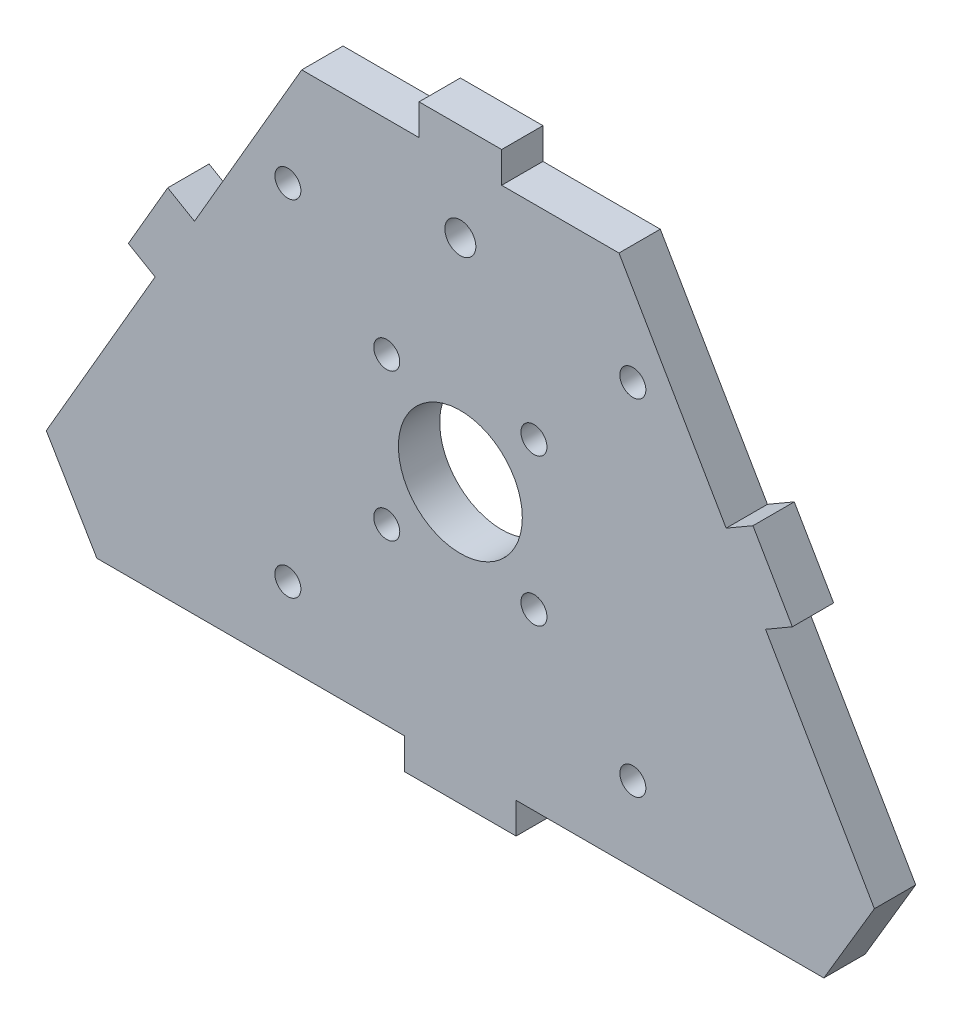
ISO-10303-21;
HEADER;
FILE_DESCRIPTION(('STEP AP214'),'2;1');
FILE_NAME('part.step','',(''),(''),'','','');
FILE_SCHEMA(('AUTOMOTIVE_DESIGN { 1 0 10303 214 1 1 1 1 }'));
ENDSEC;
DATA;
#1=APPLICATION_CONTEXT('core data for automotive mechanical design processes');
#2=APPLICATION_PROTOCOL_DEFINITION('international standard','automotive_design',2000,#1);
#3=PRODUCT_CONTEXT('',#1,'mechanical');
#4=PRODUCT('Part','Part','',(#3));
#5=PRODUCT_RELATED_PRODUCT_CATEGORY('part','',(#4));
#6=PRODUCT_DEFINITION_FORMATION('','',#4);
#7=PRODUCT_DEFINITION_CONTEXT('part definition',#1,'design');
#8=PRODUCT_DEFINITION('design','',#6,#7);
#9=PRODUCT_DEFINITION_SHAPE('','',#8);
#10=(LENGTH_UNIT() NAMED_UNIT(*) SI_UNIT(.MILLI.,.METRE.));
#11=(NAMED_UNIT(*) PLANE_ANGLE_UNIT() SI_UNIT($,.RADIAN.));
#12=(NAMED_UNIT(*) SI_UNIT($,.STERADIAN.) SOLID_ANGLE_UNIT());
#13=UNCERTAINTY_MEASURE_WITH_UNIT(LENGTH_MEASURE(1.E-05),#10,'distance_accuracy_value','');
#14=(GEOMETRIC_REPRESENTATION_CONTEXT(3) GLOBAL_UNCERTAINTY_ASSIGNED_CONTEXT((#13)) GLOBAL_UNIT_ASSIGNED_CONTEXT((#10,
#11,#12)) REPRESENTATION_CONTEXT('',''));
#15=CARTESIAN_POINT('',(0.,0.,0.));
#16=DIRECTION('',(0.,0.,1.));
#17=DIRECTION('',(1.,0.,0.));
#18=AXIS2_PLACEMENT_3D('',#15,#16,#17);
#19=CARTESIAN_POINT('',(24.384,80.772,6.35));
#20=DIRECTION('',(0.,-1.,0.));
#21=DIRECTION('',(0.,0.,-1.));
#22=AXIS2_PLACEMENT_3D('',#19,#20,#21);
#23=PLANE('',#22);
#24=DIRECTION('',(0.,0.,-1.));
#25=VECTOR('',#24,1.);
#26=CARTESIAN_POINT('',(6.35,80.772,0.));
#27=LINE('',#26,#25);
#28=CARTESIAN_POINT('',(6.35,80.772,6.35));
#29=VERTEX_POINT('',#28);
#30=CARTESIAN_POINT('',(6.35,80.772,0.));
#31=VERTEX_POINT('',#30);
#32=EDGE_CURVE('E57',#29,#31,#27,.T.);
#33=ORIENTED_EDGE('',*,*,#32,.F.);
#34=DIRECTION('',(-1.,0.,0.));
#35=VECTOR('',#34,1.);
#36=CARTESIAN_POINT('',(24.384,80.772,6.35));
#37=LINE('',#36,#35);
#38=CARTESIAN_POINT('',(24.384,80.772,6.35));
#39=VERTEX_POINT('',#38);
#40=EDGE_CURVE('E427',#39,#29,#37,.T.);
#41=ORIENTED_EDGE('',*,*,#40,.F.);
#42=DIRECTION('',(0.,0.,-1.));
#43=VECTOR('',#42,1.);
#44=CARTESIAN_POINT('',(24.384,80.772,6.35));
#45=LINE('',#44,#43);
#46=CARTESIAN_POINT('',(24.384,80.772,0.));
#47=VERTEX_POINT('',#46);
#48=EDGE_CURVE('E50',#39,#47,#45,.T.);
#49=ORIENTED_EDGE('',*,*,#48,.T.);
#50=DIRECTION('',(-1.,0.,0.));
#51=VECTOR('',#50,1.);
#52=CARTESIAN_POINT('',(24.384,80.772,0.));
#53=LINE('',#52,#51);
#54=EDGE_CURVE('E452',#47,#31,#53,.T.);
#55=ORIENTED_EDGE('',*,*,#54,.T.);
#56=EDGE_LOOP('',(#33,#41,#49,#55));
#57=FACE_BOUND('',#56,.T.);
#58=ADVANCED_FACE('F41',(#57),#23,.F.);
#59=DIRECTION('',(0.,0.,1.));
#60=VECTOR('',#59,1.);
#61=CARTESIAN_POINT('',(-6.35,80.772,0.));
#62=LINE('',#61,#60);
#63=CARTESIAN_POINT('',(-6.35,80.772,0.));
#64=VERTEX_POINT('',#63);
#65=CARTESIAN_POINT('',(-6.35,80.772,6.35));
#66=VERTEX_POINT('',#65);
#67=EDGE_CURVE('E65',#64,#66,#62,.T.);
#68=ORIENTED_EDGE('',*,*,#67,.F.);
#69=CARTESIAN_POINT('',(-24.384,80.772,0.));
#70=VERTEX_POINT('',#69);
#71=EDGE_CURVE('E451',#64,#70,#53,.T.);
#72=ORIENTED_EDGE('',*,*,#71,.T.);
#73=DIRECTION('',(0.,0.,-1.));
#74=VECTOR('',#73,1.);
#75=CARTESIAN_POINT('',(-24.384,80.772,6.35));
#76=LINE('',#75,#74);
#77=CARTESIAN_POINT('',(-24.384,80.772,6.35));
#78=VERTEX_POINT('',#77);
#79=EDGE_CURVE('E476',#78,#70,#76,.T.);
#80=ORIENTED_EDGE('',*,*,#79,.F.);
#81=EDGE_CURVE('E426',#66,#78,#37,.T.);
#82=ORIENTED_EDGE('',*,*,#81,.F.);
#83=EDGE_LOOP('',(#68,#72,#80,#82));
#84=FACE_BOUND('',#83,.T.);
#85=ADVANCED_FACE('F558',(#84),#23,.F.);
#86=CARTESIAN_POINT('',(24.384,80.772,6.35));
#87=DIRECTION('',(-0.864899412794248,-0.50194522186008,0.));
#88=DIRECTION('',(0.50194522186008,-0.864899412794248,0.));
#89=AXIS2_PLACEMENT_3D('',#86,#87,#88);
#90=PLANE('',#89);
#91=DIRECTION('',(0.,0.,1.));
#92=VECTOR('',#91,1.);
#93=CARTESIAN_POINT('',(40.8626106610555,52.3777847276713,6.35));
#94=LINE('',#93,#92);
#95=CARTESIAN_POINT('',(40.8626106610555,52.3777847276713,0.));
#96=VERTEX_POINT('',#95);
#97=CARTESIAN_POINT('',(40.8626106610555,52.3777847276712,6.35));
#98=VERTEX_POINT('',#97);
#99=EDGE_CURVE('E218',#96,#98,#94,.T.);
#100=ORIENTED_EDGE('',*,*,#99,.F.);
#101=DIRECTION('',(-0.50194522186008,0.864899412794248,0.));
#102=VECTOR('',#101,1.);
#103=CARTESIAN_POINT('',(24.384,80.772,0.));
#104=LINE('',#103,#102);
#105=EDGE_CURVE('E447',#96,#47,#104,.T.);
#106=ORIENTED_EDGE('',*,*,#105,.T.);
#107=ORIENTED_EDGE('',*,*,#48,.F.);
#108=DIRECTION('',(-0.50194522186008,0.864899412794248,0.));
#109=VECTOR('',#108,1.);
#110=CARTESIAN_POINT('',(24.384,80.772,6.35));
#111=LINE('',#110,#109);
#112=EDGE_CURVE('E420',#98,#39,#111,.T.);
#113=ORIENTED_EDGE('',*,*,#112,.F.);
#114=EDGE_LOOP('',(#100,#106,#107,#113));
#115=FACE_BOUND('',#114,.T.);
#116=ADVANCED_FACE('F487',(#115),#90,.F.);
#117=DIRECTION('',(0.,0.,-1.));
#118=VECTOR('',#117,1.);
#119=CARTESIAN_POINT('',(46.9185797627974,41.9427733123087,6.35));
#120=LINE('',#119,#118);
#121=CARTESIAN_POINT('',(46.9185797627974,41.9427733123086,6.35));
#122=VERTEX_POINT('',#121);
#123=CARTESIAN_POINT('',(46.9185797627974,41.9427733123086,0.));
#124=VERTEX_POINT('',#123);
#125=EDGE_CURVE('E223',#122,#124,#120,.T.);
#126=ORIENTED_EDGE('',*,*,#125,.F.);
#127=CARTESIAN_POINT('',(63.6521785965578,13.1091891382804,6.35));
#128=VERTEX_POINT('',#127);
#129=EDGE_CURVE('E422',#128,#122,#111,.T.);
#130=ORIENTED_EDGE('',*,*,#129,.F.);
#131=DIRECTION('',(0.,0.,-1.));
#132=VECTOR('',#131,1.);
#133=CARTESIAN_POINT('',(63.6521785965578,13.1091891382804,6.35));
#134=LINE('',#133,#132);
#135=CARTESIAN_POINT('',(63.6521785965578,13.1091891382804,0.));
#136=VERTEX_POINT('',#135);
#137=EDGE_CURVE('E11',#128,#136,#134,.T.);
#138=ORIENTED_EDGE('',*,*,#137,.T.);
#139=EDGE_CURVE('E448',#136,#124,#104,.T.);
#140=ORIENTED_EDGE('',*,*,#139,.T.);
#141=EDGE_LOOP('',(#126,#130,#138,#140));
#142=FACE_BOUND('',#141,.T.);
#143=ADVANCED_FACE('F500',(#142),#90,.F.);
#144=CARTESIAN_POINT('',(-24.384,80.772,6.35));
#145=DIRECTION('',(0.864899412794248,-0.50194522186008,0.));
#146=DIRECTION('',(0.50194522186008,0.864899412794248,0.));
#147=AXIS2_PLACEMENT_3D('',#144,#145,#146);
#148=PLANE('',#147);
#149=DIRECTION('',(0.,0.,-1.));
#150=VECTOR('',#149,1.);
#151=CARTESIAN_POINT('',(-40.8626106610555,52.3777847276713,0.));
#152=LINE('',#151,#150);
#153=CARTESIAN_POINT('',(-40.8626106610555,52.3777847276712,6.35));
#154=VERTEX_POINT('',#153);
#155=CARTESIAN_POINT('',(-40.8626106610555,52.3777847276712,0.));
#156=VERTEX_POINT('',#155);
#157=EDGE_CURVE('E261',#154,#156,#152,.T.);
#158=ORIENTED_EDGE('',*,*,#157,.F.);
#159=DIRECTION('',(-0.50194522186008,-0.864899412794248,0.));
#160=VECTOR('',#159,1.);
#161=CARTESIAN_POINT('',(-24.384,80.772,6.35));
#162=LINE('',#161,#160);
#163=EDGE_CURVE('E431',#78,#154,#162,.T.);
#164=ORIENTED_EDGE('',*,*,#163,.F.);
#165=ORIENTED_EDGE('',*,*,#79,.T.);
#166=DIRECTION('',(-0.50194522186008,-0.864899412794248,0.));
#167=VECTOR('',#166,1.);
#168=CARTESIAN_POINT('',(-24.384,80.772,0.));
#169=LINE('',#168,#167);
#170=EDGE_CURVE('E456',#70,#156,#169,.T.);
#171=ORIENTED_EDGE('',*,*,#170,.T.);
#172=EDGE_LOOP('',(#158,#164,#165,#171));
#173=FACE_BOUND('',#172,.T.);
#174=ADVANCED_FACE('F553',(#173),#148,.F.);
#175=DIRECTION('',(0.,0.,1.));
#176=VECTOR('',#175,1.);
#177=CARTESIAN_POINT('',(-46.9185797627974,41.9427733123087,0.));
#178=LINE('',#177,#176);
#179=CARTESIAN_POINT('',(-46.9185797627974,41.9427733123087,0.));
#180=VERTEX_POINT('',#179);
#181=CARTESIAN_POINT('',(-46.9185797627974,41.9427733123086,6.35));
#182=VERTEX_POINT('',#181);
#183=EDGE_CURVE('E267',#180,#182,#178,.T.);
#184=ORIENTED_EDGE('',*,*,#183,.F.);
#185=CARTESIAN_POINT('',(-63.6521785965578,13.1091891382804,0.));
#186=VERTEX_POINT('',#185);
#187=EDGE_CURVE('E455',#180,#186,#169,.T.);
#188=ORIENTED_EDGE('',*,*,#187,.T.);
#189=DIRECTION('',(0.,0.,-1.));
#190=VECTOR('',#189,1.);
#191=CARTESIAN_POINT('',(-63.6521785965578,13.1091891382804,6.35));
#192=LINE('',#191,#190);
#193=CARTESIAN_POINT('',(-63.6521785965578,13.1091891382804,6.35));
#194=VERTEX_POINT('',#193);
#195=EDGE_CURVE('E472',#194,#186,#192,.T.);
#196=ORIENTED_EDGE('',*,*,#195,.F.);
#197=EDGE_CURVE('E430',#182,#194,#162,.T.);
#198=ORIENTED_EDGE('',*,*,#197,.F.);
#199=EDGE_LOOP('',(#184,#188,#196,#198));
#200=FACE_BOUND('',#199,.T.);
#201=ADVANCED_FACE('F539',(#200),#148,.F.);
#202=CARTESIAN_POINT('',(-55.88,0.,6.35));
#203=DIRECTION('',(0.,1.,0.));
#204=DIRECTION('',(0.,0.,1.));
#205=AXIS2_PLACEMENT_3D('',#202,#203,#204);
#206=PLANE('',#205);
#207=DIRECTION('',(0.,0.,1.));
#208=VECTOR('',#207,1.);
#209=CARTESIAN_POINT('',(8.5725,0.,6.35));
#210=LINE('',#209,#208);
#211=CARTESIAN_POINT('',(8.5725,0.,0.));
#212=VERTEX_POINT('',#211);
#213=CARTESIAN_POINT('',(8.5725,0.,6.35));
#214=VERTEX_POINT('',#213);
#215=EDGE_CURVE('E298',#212,#214,#210,.T.);
#216=ORIENTED_EDGE('',*,*,#215,.F.);
#217=DIRECTION('',(1.,0.,0.));
#218=VECTOR('',#217,1.);
#219=CARTESIAN_POINT('',(-55.88,0.,0.));
#220=LINE('',#219,#218);
#221=CARTESIAN_POINT('',(55.88,0.,0.));
#222=VERTEX_POINT('',#221);
#223=EDGE_CURVE('E462',#212,#222,#220,.T.);
#224=ORIENTED_EDGE('',*,*,#223,.T.);
#225=DIRECTION('',(0.,0.,-1.));
#226=VECTOR('',#225,1.);
#227=CARTESIAN_POINT('',(55.88,0.,6.35));
#228=LINE('',#227,#226);
#229=CARTESIAN_POINT('',(55.88,0.,6.35));
#230=VERTEX_POINT('',#229);
#231=EDGE_CURVE('E443',#230,#222,#228,.T.);
#232=ORIENTED_EDGE('',*,*,#231,.F.);
#233=DIRECTION('',(1.,0.,0.));
#234=VECTOR('',#233,1.);
#235=CARTESIAN_POINT('',(-55.88,0.,6.35));
#236=LINE('',#235,#234);
#237=EDGE_CURVE('E438',#214,#230,#236,.T.);
#238=ORIENTED_EDGE('',*,*,#237,.F.);
#239=EDGE_LOOP('',(#216,#224,#232,#238));
#240=FACE_BOUND('',#239,.T.);
#241=ADVANCED_FACE('F602',(#240),#206,.F.);
#242=DIRECTION('',(0.,0.,-1.));
#243=VECTOR('',#242,1.);
#244=CARTESIAN_POINT('',(-8.5725,0.,6.35));
#245=LINE('',#244,#243);
#246=CARTESIAN_POINT('',(-8.5725,0.,6.35));
#247=VERTEX_POINT('',#246);
#248=CARTESIAN_POINT('',(-8.5725,0.,0.));
#249=VERTEX_POINT('',#248);
#250=EDGE_CURVE('E304',#247,#249,#245,.T.);
#251=ORIENTED_EDGE('',*,*,#250,.F.);
#252=CARTESIAN_POINT('',(-55.88,0.,6.35));
#253=VERTEX_POINT('',#252);
#254=EDGE_CURVE('E439',#253,#247,#236,.T.);
#255=ORIENTED_EDGE('',*,*,#254,.F.);
#256=DIRECTION('',(0.,0.,-1.));
#257=VECTOR('',#256,1.);
#258=CARTESIAN_POINT('',(-55.88,0.,6.35));
#259=LINE('',#258,#257);
#260=CARTESIAN_POINT('',(-55.88,0.,0.));
#261=VERTEX_POINT('',#260);
#262=EDGE_CURVE('E468',#253,#261,#259,.T.);
#263=ORIENTED_EDGE('',*,*,#262,.T.);
#264=EDGE_CURVE('E421',#261,#249,#220,.T.);
#265=ORIENTED_EDGE('',*,*,#264,.T.);
#266=EDGE_LOOP('',(#251,#255,#263,#265));
#267=FACE_BOUND('',#266,.T.);
#268=ADVANCED_FACE('F527',(#267),#206,.F.);
#269=CARTESIAN_POINT('',(63.6521785965578,13.1091891382804,6.35));
#270=DIRECTION('',(-0.860183014322861,0.509985472215079,0.));
#271=DIRECTION('',(-0.509985472215079,-0.860183014322861,0.));
#272=AXIS2_PLACEMENT_3D('',#269,#270,#271);
#273=PLANE('',#272);
#274=DIRECTION('',(0.509985472215079,0.860183014322861,0.));
#275=VECTOR('',#274,1.);
#276=CARTESIAN_POINT('',(63.6521785965578,13.1091891382804,0.));
#277=LINE('',#276,#275);
#278=EDGE_CURVE('E412',#222,#136,#277,.T.);
#279=ORIENTED_EDGE('',*,*,#278,.T.);
#280=ORIENTED_EDGE('',*,*,#137,.F.);
#281=DIRECTION('',(0.509985472215079,0.860183014322861,0.));
#282=VECTOR('',#281,1.);
#283=CARTESIAN_POINT('',(63.6521785965578,13.1091891382804,6.35));
#284=LINE('',#283,#282);
#285=EDGE_CURVE('E416',#230,#128,#284,.T.);
#286=ORIENTED_EDGE('',*,*,#285,.F.);
#287=ORIENTED_EDGE('',*,*,#231,.T.);
#288=EDGE_LOOP('',(#279,#280,#286,#287));
#289=FACE_BOUND('',#288,.T.);
#290=ADVANCED_FACE('F43',(#289),#273,.F.);
#291=CARTESIAN_POINT('',(-63.6521785965578,13.1091891382804,6.35));
#292=DIRECTION('',(0.860183014322861,0.509985472215079,0.));
#293=DIRECTION('',(-0.509985472215079,0.860183014322861,0.));
#294=AXIS2_PLACEMENT_3D('',#291,#292,#293);
#295=PLANE('',#294);
#296=DIRECTION('',(0.509985472215079,-0.860183014322861,0.));
#297=VECTOR('',#296,1.);
#298=CARTESIAN_POINT('',(-63.6521785965578,13.1091891382804,0.));
#299=LINE('',#298,#297);
#300=EDGE_CURVE('E459',#186,#261,#299,.T.);
#301=ORIENTED_EDGE('',*,*,#300,.T.);
#302=ORIENTED_EDGE('',*,*,#262,.F.);
#303=DIRECTION('',(0.509985472215079,-0.860183014322861,0.));
#304=VECTOR('',#303,1.);
#305=CARTESIAN_POINT('',(-63.6521785965578,13.1091891382804,6.35));
#306=LINE('',#305,#304);
#307=EDGE_CURVE('E435',#194,#253,#306,.T.);
#308=ORIENTED_EDGE('',*,*,#307,.F.);
#309=ORIENTED_EDGE('',*,*,#195,.T.);
#310=EDGE_LOOP('',(#301,#302,#308,#309));
#311=FACE_BOUND('',#310,.T.);
#312=ADVANCED_FACE('F532',(#311),#295,.F.);
#313=CARTESIAN_POINT('',(0.,0.,6.35));
#314=DIRECTION('',(0.,0.,1.));
#315=DIRECTION('',(1.,0.,0.));
#316=AXIS2_PLACEMENT_3D('',#313,#314,#315);
#317=PLANE('',#316);
#318=CARTESIAN_POINT('',(0.,70.612,6.35));
#319=DIRECTION('',(0.,0.,1.));
#320=DIRECTION('',(1.,0.,0.));
#321=AXIS2_PLACEMENT_3D('',#318,#319,#320);
#322=CIRCLE('',#321,2.38125);
#323=CARTESIAN_POINT('',(2.38125,70.612,6.35));
#324=VERTEX_POINT('',#323);
#325=EDGE_CURVE('E335',#324,#324,#322,.T.);
#326=ORIENTED_EDGE('',*,*,#325,.F.);
#327=EDGE_LOOP('',(#326));
#328=FACE_BOUND('',#327,.T.);
#329=CARTESIAN_POINT('',(-11.3137084989848,49.4137084989848,6.35));
#330=DIRECTION('',(0.,0.,1.));
#331=DIRECTION('',(1.,0.,0.));
#332=AXIS2_PLACEMENT_3D('',#329,#330,#331);
#333=CIRCLE('',#332,2.);
#334=CARTESIAN_POINT('',(-9.31370849898476,49.4137084989848,6.35));
#335=VERTEX_POINT('',#334);
#336=EDGE_CURVE('E375',#335,#335,#333,.T.);
#337=ORIENTED_EDGE('',*,*,#336,.F.);
#338=EDGE_LOOP('',(#337));
#339=FACE_BOUND('',#338,.T.);
#340=CARTESIAN_POINT('',(-11.3137084989848,26.7862915010152,6.35));
#341=DIRECTION('',(0.,0.,1.));
#342=DIRECTION('',(1.,0.,0.));
#343=AXIS2_PLACEMENT_3D('',#340,#341,#342);
#344=CIRCLE('',#343,2.);
#345=CARTESIAN_POINT('',(-9.31370849898476,26.7862915010152,6.35));
#346=VERTEX_POINT('',#345);
#347=EDGE_CURVE('E383',#346,#346,#344,.T.);
#348=ORIENTED_EDGE('',*,*,#347,.F.);
#349=EDGE_LOOP('',(#348));
#350=FACE_BOUND('',#349,.T.);
#351=CARTESIAN_POINT('',(11.3137084989848,26.7862915010152,6.35));
#352=DIRECTION('',(0.,0.,1.));
#353=DIRECTION('',(1.,0.,0.));
#354=AXIS2_PLACEMENT_3D('',#351,#352,#353);
#355=CIRCLE('',#354,2.);
#356=CARTESIAN_POINT('',(13.3137084989848,26.7862915010152,6.35));
#357=VERTEX_POINT('',#356);
#358=EDGE_CURVE('E391',#357,#357,#355,.T.);
#359=ORIENTED_EDGE('',*,*,#358,.F.);
#360=EDGE_LOOP('',(#359));
#361=FACE_BOUND('',#360,.T.);
#362=CARTESIAN_POINT('',(11.3137084989848,49.4137084989848,6.35));
#363=DIRECTION('',(0.,0.,1.));
#364=DIRECTION('',(1.,0.,0.));
#365=AXIS2_PLACEMENT_3D('',#362,#363,#364);
#366=CIRCLE('',#365,2.);
#367=CARTESIAN_POINT('',(13.3137084989848,49.4137084989848,6.35));
#368=VERTEX_POINT('',#367);
#369=EDGE_CURVE('E340',#368,#368,#366,.T.);
#370=ORIENTED_EDGE('',*,*,#369,.F.);
#371=EDGE_LOOP('',(#370));
#372=FACE_BOUND('',#371,.T.);
#373=CARTESIAN_POINT('',(26.5165042944955,64.6165042944955,6.35));
#374=DIRECTION('',(0.,0.,1.));
#375=DIRECTION('',(1.,0.,0.));
#376=AXIS2_PLACEMENT_3D('',#373,#374,#375);
#377=CIRCLE('',#376,2.00000000000001);
#378=CARTESIAN_POINT('',(28.5165042944955,64.6165042944955,6.35));
#379=VERTEX_POINT('',#378);
#380=EDGE_CURVE('E341',#379,#379,#377,.T.);
#381=ORIENTED_EDGE('',*,*,#380,.F.);
#382=EDGE_LOOP('',(#381));
#383=FACE_BOUND('',#382,.T.);
#384=CARTESIAN_POINT('',(-26.5165042944955,64.6165042944955,6.35));
#385=DIRECTION('',(0.,0.,1.));
#386=DIRECTION('',(1.,0.,0.));
#387=AXIS2_PLACEMENT_3D('',#384,#385,#386);
#388=CIRCLE('',#387,2.00000000000001);
#389=CARTESIAN_POINT('',(-24.5165042944955,64.6165042944955,6.35));
#390=VERTEX_POINT('',#389);
#391=EDGE_CURVE('E349',#390,#390,#388,.T.);
#392=ORIENTED_EDGE('',*,*,#391,.F.);
#393=EDGE_LOOP('',(#392));
#394=FACE_BOUND('',#393,.T.);
#395=CARTESIAN_POINT('',(-26.5165042944955,11.5834957055045,6.35));
#396=DIRECTION('',(0.,0.,1.));
#397=DIRECTION('',(1.,0.,0.));
#398=AXIS2_PLACEMENT_3D('',#395,#396,#397);
#399=CIRCLE('',#398,2.00000000000001);
#400=CARTESIAN_POINT('',(-24.5165042944955,11.5834957055045,6.35));
#401=VERTEX_POINT('',#400);
#402=EDGE_CURVE('E357',#401,#401,#399,.T.);
#403=ORIENTED_EDGE('',*,*,#402,.F.);
#404=EDGE_LOOP('',(#403));
#405=FACE_BOUND('',#404,.T.);
#406=CARTESIAN_POINT('',(26.5165042944956,11.5834957055045,6.35));
#407=DIRECTION('',(0.,0.,1.));
#408=DIRECTION('',(1.,0.,0.));
#409=AXIS2_PLACEMENT_3D('',#406,#407,#408);
#410=CIRCLE('',#409,2.00000000000001);
#411=CARTESIAN_POINT('',(28.5165042944956,11.5834957055045,6.35));
#412=VERTEX_POINT('',#411);
#413=EDGE_CURVE('E365',#412,#412,#410,.T.);
#414=ORIENTED_EDGE('',*,*,#413,.F.);
#415=EDGE_LOOP('',(#414));
#416=FACE_BOUND('',#415,.T.);
#417=CARTESIAN_POINT('',(0.,38.1,6.35));
#418=DIRECTION('',(0.,0.,1.));
#419=DIRECTION('',(1.,0.,0.));
#420=AXIS2_PLACEMENT_3D('',#417,#418,#419);
#421=CIRCLE('',#420,9.52499999999999);
#422=CARTESIAN_POINT('',(9.525,38.1,6.35));
#423=VERTEX_POINT('',#422);
#424=EDGE_CURVE('E374',#423,#423,#421,.T.);
#425=ORIENTED_EDGE('',*,*,#424,.F.);
#426=EDGE_LOOP('',(#425));
#427=FACE_BOUND('',#426,.T.);
#428=ORIENTED_EDGE('',*,*,#285,.T.);
#429=ORIENTED_EDGE('',*,*,#129,.T.);
#430=DIRECTION('',(-0.864899412794248,-0.50194522186008,0.));
#431=VECTOR('',#430,1.);
#432=CARTESIAN_POINT('',(51.03766321623,44.3332874314173,6.35));
#433=LINE('',#432,#431);
#434=CARTESIAN_POINT('',(51.03766321623,44.3332874314173,6.35));
#435=VERTEX_POINT('',#434);
#436=EDGE_CURVE('E249',#435,#122,#433,.T.);
#437=ORIENTED_EDGE('',*,*,#436,.F.);
#438=DIRECTION('',(0.501945221860081,-0.864899412794248,0.));
#439=VECTOR('',#438,1.);
#440=CARTESIAN_POINT('',(44.9816941144881,54.7682988467799,6.35));
#441=LINE('',#440,#439);
#442=CARTESIAN_POINT('',(44.9816941144881,54.7682988467799,6.35));
#443=VERTEX_POINT('',#442);
#444=EDGE_CURVE('E236',#443,#435,#441,.T.);
#445=ORIENTED_EDGE('',*,*,#444,.F.);
#446=DIRECTION('',(-0.864899412794248,-0.50194522186008,0.));
#447=VECTOR('',#446,1.);
#448=CARTESIAN_POINT('',(44.9816941144881,54.7682988467799,6.35));
#449=LINE('',#448,#447);
#450=EDGE_CURVE('E253',#443,#98,#449,.T.);
#451=ORIENTED_EDGE('',*,*,#450,.T.);
#452=ORIENTED_EDGE('',*,*,#112,.T.);
#453=ORIENTED_EDGE('',*,*,#40,.T.);
#454=DIRECTION('',(0.,-1.,0.));
#455=VECTOR('',#454,1.);
#456=CARTESIAN_POINT('',(6.35,85.5345,6.35));
#457=LINE('',#456,#455);
#458=CARTESIAN_POINT('',(6.35,85.5345,6.35));
#459=VERTEX_POINT('',#458);
#460=EDGE_CURVE('E563',#459,#29,#457,.T.);
#461=ORIENTED_EDGE('',*,*,#460,.F.);
#462=DIRECTION('',(1.,0.,0.));
#463=VECTOR('',#462,1.);
#464=CARTESIAN_POINT('',(-6.35,85.5345,6.35));
#465=LINE('',#464,#463);
#466=CARTESIAN_POINT('',(-6.35,85.5345,6.35));
#467=VERTEX_POINT('',#466);
#468=EDGE_CURVE('E210',#467,#459,#465,.T.);
#469=ORIENTED_EDGE('',*,*,#468,.F.);
#470=DIRECTION('',(0.,-1.,0.));
#471=VECTOR('',#470,1.);
#472=CARTESIAN_POINT('',(-6.35,85.5345,6.35));
#473=LINE('',#472,#471);
#474=EDGE_CURVE('E225',#467,#66,#473,.T.);
#475=ORIENTED_EDGE('',*,*,#474,.T.);
#476=ORIENTED_EDGE('',*,*,#81,.T.);
#477=ORIENTED_EDGE('',*,*,#163,.T.);
#478=DIRECTION('',(0.864899412794248,-0.50194522186008,0.));
#479=VECTOR('',#478,1.);
#480=CARTESIAN_POINT('',(-44.9816941144881,54.7682988467799,6.35));
#481=LINE('',#480,#479);
#482=CARTESIAN_POINT('',(-44.9816941144881,54.7682988467799,6.35));
#483=VERTEX_POINT('',#482);
#484=EDGE_CURVE('E294',#483,#154,#481,.T.);
#485=ORIENTED_EDGE('',*,*,#484,.F.);
#486=DIRECTION('',(0.501945221860081,0.864899412794248,0.));
#487=VECTOR('',#486,1.);
#488=CARTESIAN_POINT('',(-44.9816941144881,54.7682988467799,6.35));
#489=LINE('',#488,#487);
#490=CARTESIAN_POINT('',(-51.03766321623,44.3332874314173,6.35));
#491=VERTEX_POINT('',#490);
#492=EDGE_CURVE('E262',#491,#483,#489,.T.);
#493=ORIENTED_EDGE('',*,*,#492,.F.);
#494=DIRECTION('',(0.864899412794248,-0.50194522186008,0.));
#495=VECTOR('',#494,1.);
#496=CARTESIAN_POINT('',(-51.03766321623,44.3332874314173,6.35));
#497=LINE('',#496,#495);
#498=EDGE_CURVE('E276',#491,#182,#497,.T.);
#499=ORIENTED_EDGE('',*,*,#498,.T.);
#500=ORIENTED_EDGE('',*,*,#197,.T.);
#501=ORIENTED_EDGE('',*,*,#307,.T.);
#502=ORIENTED_EDGE('',*,*,#254,.T.);
#503=DIRECTION('',(0.,1.,0.));
#504=VECTOR('',#503,1.);
#505=CARTESIAN_POINT('',(-8.5725,-4.7625,6.35));
#506=LINE('',#505,#504);
#507=CARTESIAN_POINT('',(-8.5725,-4.7625,6.35));
#508=VERTEX_POINT('',#507);
#509=EDGE_CURVE('E327',#508,#247,#506,.T.);
#510=ORIENTED_EDGE('',*,*,#509,.F.);
#511=DIRECTION('',(-1.,0.,0.));
#512=VECTOR('',#511,1.);
#513=CARTESIAN_POINT('',(-8.5725,-4.7625,6.35));
#514=LINE('',#513,#512);
#515=CARTESIAN_POINT('',(8.5725,-4.7625,6.35));
#516=VERTEX_POINT('',#515);
#517=EDGE_CURVE('E303',#516,#508,#514,.T.);
#518=ORIENTED_EDGE('',*,*,#517,.F.);
#519=DIRECTION('',(0.,1.,0.));
#520=VECTOR('',#519,1.);
#521=CARTESIAN_POINT('',(8.5725,-4.7625,6.35));
#522=LINE('',#521,#520);
#523=EDGE_CURVE('E331',#516,#214,#522,.T.);
#524=ORIENTED_EDGE('',*,*,#523,.T.);
#525=ORIENTED_EDGE('',*,*,#237,.T.);
#526=EDGE_LOOP('',(#428,#429,#437,#445,#451,#452,#453,#461,#469,#475,#476,#477,#485,#493,#499,
#500,#501,#502,#510,#518,#524,#525));
#527=FACE_BOUND('',#526,.T.);
#528=ADVANCED_FACE('F502',(#328,#339,#350,#361,#372,#383,#394,#405,#416,#427,#527),#317,.T.);
#529=CARTESIAN_POINT('',(0.,0.,0.));
#530=DIRECTION('',(0.,0.,1.));
#531=DIRECTION('',(1.,0.,0.));
#532=AXIS2_PLACEMENT_3D('',#529,#530,#531);
#533=PLANE('',#532);
#534=CARTESIAN_POINT('',(0.,70.612,0.));
#535=DIRECTION('',(0.,0.,1.));
#536=DIRECTION('',(1.,0.,0.));
#537=AXIS2_PLACEMENT_3D('',#534,#535,#536);
#538=CIRCLE('',#537,2.38125);
#539=CARTESIAN_POINT('',(2.38125,70.612,0.));
#540=VERTEX_POINT('',#539);
#541=EDGE_CURVE('E369',#540,#540,#538,.T.);
#542=ORIENTED_EDGE('',*,*,#541,.T.);
#543=EDGE_LOOP('',(#542));
#544=FACE_BOUND('',#543,.T.);
#545=CARTESIAN_POINT('',(-11.3137084989848,49.4137084989848,0.));
#546=DIRECTION('',(0.,0.,1.));
#547=DIRECTION('',(1.,0.,0.));
#548=AXIS2_PLACEMENT_3D('',#545,#546,#547);
#549=CIRCLE('',#548,2.);
#550=CARTESIAN_POINT('',(-9.31370849898476,49.4137084989848,0.));
#551=VERTEX_POINT('',#550);
#552=EDGE_CURVE('E370',#551,#551,#549,.T.);
#553=ORIENTED_EDGE('',*,*,#552,.T.);
#554=EDGE_LOOP('',(#553));
#555=FACE_BOUND('',#554,.T.);
#556=CARTESIAN_POINT('',(-11.3137084989848,26.7862915010152,0.));
#557=DIRECTION('',(0.,0.,1.));
#558=DIRECTION('',(1.,0.,0.));
#559=AXIS2_PLACEMENT_3D('',#556,#557,#558);
#560=CIRCLE('',#559,2.);
#561=CARTESIAN_POINT('',(-9.31370849898476,26.7862915010152,0.));
#562=VERTEX_POINT('',#561);
#563=EDGE_CURVE('E379',#562,#562,#560,.T.);
#564=ORIENTED_EDGE('',*,*,#563,.T.);
#565=EDGE_LOOP('',(#564));
#566=FACE_BOUND('',#565,.T.);
#567=CARTESIAN_POINT('',(11.3137084989848,26.7862915010152,0.));
#568=DIRECTION('',(0.,0.,1.));
#569=DIRECTION('',(1.,0.,0.));
#570=AXIS2_PLACEMENT_3D('',#567,#568,#569);
#571=CIRCLE('',#570,2.);
#572=CARTESIAN_POINT('',(13.3137084989848,26.7862915010152,0.));
#573=VERTEX_POINT('',#572);
#574=EDGE_CURVE('E387',#573,#573,#571,.T.);
#575=ORIENTED_EDGE('',*,*,#574,.T.);
#576=EDGE_LOOP('',(#575));
#577=FACE_BOUND('',#576,.T.);
#578=CARTESIAN_POINT('',(11.3137084989848,49.4137084989848,0.));
#579=DIRECTION('',(0.,0.,1.));
#580=DIRECTION('',(1.,0.,0.));
#581=AXIS2_PLACEMENT_3D('',#578,#579,#580);
#582=CIRCLE('',#581,2.);
#583=CARTESIAN_POINT('',(13.3137084989848,49.4137084989848,0.));
#584=VERTEX_POINT('',#583);
#585=EDGE_CURVE('E395',#584,#584,#582,.T.);
#586=ORIENTED_EDGE('',*,*,#585,.T.);
#587=EDGE_LOOP('',(#586));
#588=FACE_BOUND('',#587,.T.);
#589=CARTESIAN_POINT('',(26.5165042944955,64.6165042944955,0.));
#590=DIRECTION('',(0.,0.,1.));
#591=DIRECTION('',(1.,0.,0.));
#592=AXIS2_PLACEMENT_3D('',#589,#590,#591);
#593=CIRCLE('',#592,2.00000000000001);
#594=CARTESIAN_POINT('',(28.5165042944955,64.6165042944955,0.));
#595=VERTEX_POINT('',#594);
#596=EDGE_CURVE('E336',#595,#595,#593,.T.);
#597=ORIENTED_EDGE('',*,*,#596,.T.);
#598=EDGE_LOOP('',(#597));
#599=FACE_BOUND('',#598,.T.);
#600=CARTESIAN_POINT('',(-26.5165042944955,64.6165042944955,0.));
#601=DIRECTION('',(0.,0.,1.));
#602=DIRECTION('',(1.,0.,0.));
#603=AXIS2_PLACEMENT_3D('',#600,#601,#602);
#604=CIRCLE('',#603,2.00000000000001);
#605=CARTESIAN_POINT('',(-24.5165042944955,64.6165042944955,0.));
#606=VERTEX_POINT('',#605);
#607=EDGE_CURVE('E345',#606,#606,#604,.T.);
#608=ORIENTED_EDGE('',*,*,#607,.T.);
#609=EDGE_LOOP('',(#608));
#610=FACE_BOUND('',#609,.T.);
#611=CARTESIAN_POINT('',(-26.5165042944955,11.5834957055045,0.));
#612=DIRECTION('',(0.,0.,1.));
#613=DIRECTION('',(1.,0.,0.));
#614=AXIS2_PLACEMENT_3D('',#611,#612,#613);
#615=CIRCLE('',#614,2.00000000000001);
#616=CARTESIAN_POINT('',(-24.5165042944955,11.5834957055045,0.));
#617=VERTEX_POINT('',#616);
#618=EDGE_CURVE('E353',#617,#617,#615,.T.);
#619=ORIENTED_EDGE('',*,*,#618,.T.);
#620=EDGE_LOOP('',(#619));
#621=FACE_BOUND('',#620,.T.);
#622=CARTESIAN_POINT('',(26.5165042944956,11.5834957055045,0.));
#623=DIRECTION('',(0.,0.,1.));
#624=DIRECTION('',(1.,0.,0.));
#625=AXIS2_PLACEMENT_3D('',#622,#623,#624);
#626=CIRCLE('',#625,2.00000000000001);
#627=CARTESIAN_POINT('',(28.5165042944956,11.5834957055045,0.));
#628=VERTEX_POINT('',#627);
#629=EDGE_CURVE('E361',#628,#628,#626,.T.);
#630=ORIENTED_EDGE('',*,*,#629,.T.);
#631=EDGE_LOOP('',(#630));
#632=FACE_BOUND('',#631,.T.);
#633=CARTESIAN_POINT('',(0.,38.1,0.));
#634=DIRECTION('',(0.,0.,1.));
#635=DIRECTION('',(1.,0.,0.));
#636=AXIS2_PLACEMENT_3D('',#633,#634,#635);
#637=CIRCLE('',#636,9.52499999999999);
#638=CARTESIAN_POINT('',(9.525,38.1,0.));
#639=VERTEX_POINT('',#638);
#640=EDGE_CURVE('E408',#639,#639,#637,.T.);
#641=ORIENTED_EDGE('',*,*,#640,.T.);
#642=EDGE_LOOP('',(#641));
#643=FACE_BOUND('',#642,.T.);
#644=ORIENTED_EDGE('',*,*,#278,.F.);
#645=ORIENTED_EDGE('',*,*,#223,.F.);
#646=DIRECTION('',(0.,1.,0.));
#647=VECTOR('',#646,1.);
#648=CARTESIAN_POINT('',(8.5725,-4.7625,0.));
#649=LINE('',#648,#647);
#650=CARTESIAN_POINT('',(8.5725,-4.7625,0.));
#651=VERTEX_POINT('',#650);
#652=EDGE_CURVE('E313',#651,#212,#649,.T.);
#653=ORIENTED_EDGE('',*,*,#652,.F.);
#654=DIRECTION('',(1.,0.,0.));
#655=VECTOR('',#654,1.);
#656=CARTESIAN_POINT('',(-8.5725,-4.7625,0.));
#657=LINE('',#656,#655);
#658=CARTESIAN_POINT('',(-8.5725,-4.7625,0.));
#659=VERTEX_POINT('',#658);
#660=EDGE_CURVE('E310',#659,#651,#657,.T.);
#661=ORIENTED_EDGE('',*,*,#660,.F.);
#662=DIRECTION('',(0.,1.,0.));
#663=VECTOR('',#662,1.);
#664=CARTESIAN_POINT('',(-8.5725,-4.7625,0.));
#665=LINE('',#664,#663);
#666=EDGE_CURVE('E323',#659,#249,#665,.T.);
#667=ORIENTED_EDGE('',*,*,#666,.T.);
#668=ORIENTED_EDGE('',*,*,#264,.F.);
#669=ORIENTED_EDGE('',*,*,#300,.F.);
#670=ORIENTED_EDGE('',*,*,#187,.F.);
#671=DIRECTION('',(0.864899412794248,-0.50194522186008,0.));
#672=VECTOR('',#671,1.);
#673=CARTESIAN_POINT('',(-51.03766321623,44.3332874314173,0.));
#674=LINE('',#673,#672);
#675=CARTESIAN_POINT('',(-51.03766321623,44.3332874314173,0.));
#676=VERTEX_POINT('',#675);
#677=EDGE_CURVE('E286',#676,#180,#674,.T.);
#678=ORIENTED_EDGE('',*,*,#677,.F.);
#679=DIRECTION('',(-0.501945221860081,-0.864899412794248,0.));
#680=VECTOR('',#679,1.);
#681=CARTESIAN_POINT('',(-44.9816941144881,54.7682988467799,0.));
#682=LINE('',#681,#680);
#683=CARTESIAN_POINT('',(-44.9816941144881,54.7682988467799,0.));
#684=VERTEX_POINT('',#683);
#685=EDGE_CURVE('E270',#684,#676,#682,.T.);
#686=ORIENTED_EDGE('',*,*,#685,.F.);
#687=DIRECTION('',(0.864899412794248,-0.50194522186008,0.));
#688=VECTOR('',#687,1.);
#689=CARTESIAN_POINT('',(-44.9816941144881,54.7682988467799,0.));
#690=LINE('',#689,#688);
#691=EDGE_CURVE('E290',#684,#156,#690,.T.);
#692=ORIENTED_EDGE('',*,*,#691,.T.);
#693=ORIENTED_EDGE('',*,*,#170,.F.);
#694=ORIENTED_EDGE('',*,*,#71,.F.);
#695=DIRECTION('',(0.,-1.,0.));
#696=VECTOR('',#695,1.);
#697=CARTESIAN_POINT('',(-6.35,85.5345,0.));
#698=LINE('',#697,#696);
#699=CARTESIAN_POINT('',(-6.35,85.5345,0.));
#700=VERTEX_POINT('',#699);
#701=EDGE_CURVE('E200',#700,#64,#698,.T.);
#702=ORIENTED_EDGE('',*,*,#701,.F.);
#703=DIRECTION('',(-1.,0.,0.));
#704=VECTOR('',#703,1.);
#705=CARTESIAN_POINT('',(-6.35,85.5345,0.));
#706=LINE('',#705,#704);
#707=CARTESIAN_POINT('',(6.35,85.5345,0.));
#708=VERTEX_POINT('',#707);
#709=EDGE_CURVE('E192',#708,#700,#706,.T.);
#710=ORIENTED_EDGE('',*,*,#709,.F.);
#711=DIRECTION('',(0.,-1.,0.));
#712=VECTOR('',#711,1.);
#713=CARTESIAN_POINT('',(6.35,85.5345,0.));
#714=LINE('',#713,#712);
#715=EDGE_CURVE('E198',#708,#31,#714,.T.);
#716=ORIENTED_EDGE('',*,*,#715,.T.);
#717=ORIENTED_EDGE('',*,*,#54,.F.);
#718=ORIENTED_EDGE('',*,*,#105,.F.);
#719=DIRECTION('',(-0.864899412794248,-0.50194522186008,0.));
#720=VECTOR('',#719,1.);
#721=CARTESIAN_POINT('',(44.9816941144881,54.7682988467799,0.));
#722=LINE('',#721,#720);
#723=CARTESIAN_POINT('',(44.9816941144881,54.7682988467799,0.));
#724=VERTEX_POINT('',#723);
#725=EDGE_CURVE('E257',#724,#96,#722,.T.);
#726=ORIENTED_EDGE('',*,*,#725,.F.);
#727=DIRECTION('',(-0.501945221860081,0.864899412794248,0.));
#728=VECTOR('',#727,1.);
#729=CARTESIAN_POINT('',(44.9816941144881,54.7682988467799,0.));
#730=LINE('',#729,#728);
#731=CARTESIAN_POINT('',(51.03766321623,44.3332874314173,0.));
#732=VERTEX_POINT('',#731);
#733=EDGE_CURVE('E229',#732,#724,#730,.T.);
#734=ORIENTED_EDGE('',*,*,#733,.F.);
#735=DIRECTION('',(-0.864899412794248,-0.50194522186008,0.));
#736=VECTOR('',#735,1.);
#737=CARTESIAN_POINT('',(51.03766321623,44.3332874314173,0.));
#738=LINE('',#737,#736);
#739=EDGE_CURVE('E241',#732,#124,#738,.T.);
#740=ORIENTED_EDGE('',*,*,#739,.T.);
#741=ORIENTED_EDGE('',*,*,#139,.F.);
#742=EDGE_LOOP('',(#644,#645,#653,#661,#667,#668,#669,#670,#678,#686,#692,#693,#694,#702,#710,
#716,#717,#718,#726,#734,#740,#741));
#743=FACE_BOUND('',#742,.T.);
#744=ADVANCED_FACE('F195',(#544,#555,#566,#577,#588,#599,#610,#621,#632,#643,#743),#533,.F.);
#745=CARTESIAN_POINT('',(0.,38.1,0.));
#746=DIRECTION('',(0.,0.,1.));
#747=DIRECTION('',(1.,0.,0.));
#748=AXIS2_PLACEMENT_3D('',#745,#746,#747);
#749=CYLINDRICAL_SURFACE('',#748,9.52499999999999);
#750=ORIENTED_EDGE('',*,*,#640,.F.);
#751=EDGE_LOOP('',(#750));
#752=FACE_BOUND('',#751,.T.);
#753=ORIENTED_EDGE('',*,*,#424,.T.);
#754=EDGE_LOOP('',(#753));
#755=FACE_BOUND('',#754,.T.);
#756=ADVANCED_FACE('F748',(#752,#755),#749,.F.);
#757=CARTESIAN_POINT('',(26.5165042944956,11.5834957055045,0.));
#758=DIRECTION('',(0.,0.,1.));
#759=DIRECTION('',(1.,0.,0.));
#760=AXIS2_PLACEMENT_3D('',#757,#758,#759);
#761=CYLINDRICAL_SURFACE('',#760,2.00000000000001);
#762=ORIENTED_EDGE('',*,*,#629,.F.);
#763=EDGE_LOOP('',(#762));
#764=FACE_BOUND('',#763,.T.);
#765=ORIENTED_EDGE('',*,*,#413,.T.);
#766=EDGE_LOOP('',(#765));
#767=FACE_BOUND('',#766,.T.);
#768=ADVANCED_FACE('F772',(#764,#767),#761,.F.);
#769=CARTESIAN_POINT('',(-26.5165042944955,11.5834957055045,0.));
#770=DIRECTION('',(0.,0.,1.));
#771=DIRECTION('',(1.,0.,0.));
#772=AXIS2_PLACEMENT_3D('',#769,#770,#771);
#773=CYLINDRICAL_SURFACE('',#772,2.00000000000001);
#774=ORIENTED_EDGE('',*,*,#618,.F.);
#775=EDGE_LOOP('',(#774));
#776=FACE_BOUND('',#775,.T.);
#777=ORIENTED_EDGE('',*,*,#402,.T.);
#778=EDGE_LOOP('',(#777));
#779=FACE_BOUND('',#778,.T.);
#780=ADVANCED_FACE('F780',(#776,#779),#773,.F.);
#781=CARTESIAN_POINT('',(-26.5165042944955,64.6165042944955,0.));
#782=DIRECTION('',(0.,0.,1.));
#783=DIRECTION('',(1.,0.,0.));
#784=AXIS2_PLACEMENT_3D('',#781,#782,#783);
#785=CYLINDRICAL_SURFACE('',#784,2.00000000000001);
#786=ORIENTED_EDGE('',*,*,#607,.F.);
#787=EDGE_LOOP('',(#786));
#788=FACE_BOUND('',#787,.T.);
#789=ORIENTED_EDGE('',*,*,#391,.T.);
#790=EDGE_LOOP('',(#789));
#791=FACE_BOUND('',#790,.T.);
#792=ADVANCED_FACE('F788',(#788,#791),#785,.F.);
#793=CARTESIAN_POINT('',(26.5165042944955,64.6165042944955,0.));
#794=DIRECTION('',(0.,0.,1.));
#795=DIRECTION('',(1.,0.,0.));
#796=AXIS2_PLACEMENT_3D('',#793,#794,#795);
#797=CYLINDRICAL_SURFACE('',#796,2.00000000000001);
#798=ORIENTED_EDGE('',*,*,#596,.F.);
#799=EDGE_LOOP('',(#798));
#800=FACE_BOUND('',#799,.T.);
#801=ORIENTED_EDGE('',*,*,#380,.T.);
#802=EDGE_LOOP('',(#801));
#803=FACE_BOUND('',#802,.T.);
#804=ADVANCED_FACE('F796',(#800,#803),#797,.F.);
#805=CARTESIAN_POINT('',(11.3137084989848,49.4137084989848,0.));
#806=DIRECTION('',(0.,0.,1.));
#807=DIRECTION('',(1.,0.,0.));
#808=AXIS2_PLACEMENT_3D('',#805,#806,#807);
#809=CYLINDRICAL_SURFACE('',#808,2.);
#810=ORIENTED_EDGE('',*,*,#585,.F.);
#811=EDGE_LOOP('',(#810));
#812=FACE_BOUND('',#811,.T.);
#813=ORIENTED_EDGE('',*,*,#369,.T.);
#814=EDGE_LOOP('',(#813));
#815=FACE_BOUND('',#814,.T.);
#816=ADVANCED_FACE('F804',(#812,#815),#809,.F.);
#817=CARTESIAN_POINT('',(11.3137084989848,26.7862915010152,0.));
#818=DIRECTION('',(0.,0.,1.));
#819=DIRECTION('',(1.,0.,0.));
#820=AXIS2_PLACEMENT_3D('',#817,#818,#819);
#821=CYLINDRICAL_SURFACE('',#820,2.);
#822=ORIENTED_EDGE('',*,*,#574,.F.);
#823=EDGE_LOOP('',(#822));
#824=FACE_BOUND('',#823,.T.);
#825=ORIENTED_EDGE('',*,*,#358,.T.);
#826=EDGE_LOOP('',(#825));
#827=FACE_BOUND('',#826,.T.);
#828=ADVANCED_FACE('F812',(#824,#827),#821,.F.);
#829=CARTESIAN_POINT('',(-11.3137084989848,26.7862915010152,0.));
#830=DIRECTION('',(0.,0.,1.));
#831=DIRECTION('',(1.,0.,0.));
#832=AXIS2_PLACEMENT_3D('',#829,#830,#831);
#833=CYLINDRICAL_SURFACE('',#832,2.);
#834=ORIENTED_EDGE('',*,*,#563,.F.);
#835=EDGE_LOOP('',(#834));
#836=FACE_BOUND('',#835,.T.);
#837=ORIENTED_EDGE('',*,*,#347,.T.);
#838=EDGE_LOOP('',(#837));
#839=FACE_BOUND('',#838,.T.);
#840=ADVANCED_FACE('F820',(#836,#839),#833,.F.);
#841=CARTESIAN_POINT('',(-11.3137084989848,49.4137084989848,0.));
#842=DIRECTION('',(0.,0.,1.));
#843=DIRECTION('',(1.,0.,0.));
#844=AXIS2_PLACEMENT_3D('',#841,#842,#843);
#845=CYLINDRICAL_SURFACE('',#844,2.);
#846=ORIENTED_EDGE('',*,*,#552,.F.);
#847=EDGE_LOOP('',(#846));
#848=FACE_BOUND('',#847,.T.);
#849=ORIENTED_EDGE('',*,*,#336,.T.);
#850=EDGE_LOOP('',(#849));
#851=FACE_BOUND('',#850,.T.);
#852=ADVANCED_FACE('F828',(#848,#851),#845,.F.);
#853=CARTESIAN_POINT('',(0.,70.612,0.));
#854=DIRECTION('',(0.,0.,1.));
#855=DIRECTION('',(1.,0.,0.));
#856=AXIS2_PLACEMENT_3D('',#853,#854,#855);
#857=CYLINDRICAL_SURFACE('',#856,2.38125);
#858=ORIENTED_EDGE('',*,*,#541,.F.);
#859=EDGE_LOOP('',(#858));
#860=FACE_BOUND('',#859,.T.);
#861=ORIENTED_EDGE('',*,*,#325,.T.);
#862=EDGE_LOOP('',(#861));
#863=FACE_BOUND('',#862,.T.);
#864=ADVANCED_FACE('F637',(#860,#863),#857,.F.);
#865=CARTESIAN_POINT('',(8.5725,-4.7625,6.35));
#866=DIRECTION('',(-1.,0.,0.));
#867=DIRECTION('',(0.,0.,1.));
#868=AXIS2_PLACEMENT_3D('',#865,#866,#867);
#869=PLANE('',#868);
#870=ORIENTED_EDGE('',*,*,#215,.T.);
#871=ORIENTED_EDGE('',*,*,#523,.F.);
#872=DIRECTION('',(0.,0.,1.));
#873=VECTOR('',#872,1.);
#874=CARTESIAN_POINT('',(8.5725,-4.7625,6.35));
#875=LINE('',#874,#873);
#876=EDGE_CURVE('E299',#651,#516,#875,.T.);
#877=ORIENTED_EDGE('',*,*,#876,.F.);
#878=ORIENTED_EDGE('',*,*,#652,.T.);
#879=EDGE_LOOP('',(#870,#871,#877,#878));
#880=FACE_BOUND('',#879,.T.);
#881=ADVANCED_FACE('F514',(#880),#869,.F.);
#882=CARTESIAN_POINT('',(-8.5725,-4.7625,6.35));
#883=DIRECTION('',(1.,0.,0.));
#884=DIRECTION('',(0.,0.,-1.));
#885=AXIS2_PLACEMENT_3D('',#882,#883,#884);
#886=PLANE('',#885);
#887=ORIENTED_EDGE('',*,*,#250,.T.);
#888=ORIENTED_EDGE('',*,*,#666,.F.);
#889=DIRECTION('',(0.,0.,-1.));
#890=VECTOR('',#889,1.);
#891=CARTESIAN_POINT('',(-8.5725,-4.7625,6.35));
#892=LINE('',#891,#890);
#893=EDGE_CURVE('E307',#508,#659,#892,.T.);
#894=ORIENTED_EDGE('',*,*,#893,.F.);
#895=ORIENTED_EDGE('',*,*,#509,.T.);
#896=EDGE_LOOP('',(#887,#888,#894,#895));
#897=FACE_BOUND('',#896,.T.);
#898=ADVANCED_FACE('F524',(#897),#886,.F.);
#899=CARTESIAN_POINT('',(0.,-4.7625,0.));
#900=DIRECTION('',(0.,-1.,0.));
#901=DIRECTION('',(0.,0.,-1.));
#902=AXIS2_PLACEMENT_3D('',#899,#900,#901);
#903=PLANE('',#902);
#904=ORIENTED_EDGE('',*,*,#876,.T.);
#905=ORIENTED_EDGE('',*,*,#517,.T.);
#906=ORIENTED_EDGE('',*,*,#893,.T.);
#907=ORIENTED_EDGE('',*,*,#660,.T.);
#908=EDGE_LOOP('',(#904,#905,#906,#907));
#909=FACE_BOUND('',#908,.T.);
#910=ADVANCED_FACE('F517',(#909),#903,.T.);
#911=CARTESIAN_POINT('',(-44.9816941144881,54.7682988467799,0.));
#912=DIRECTION('',(-0.501945221860081,-0.864899412794248,0.));
#913=DIRECTION('',(0.864899412794248,-0.501945221860081,0.));
#914=AXIS2_PLACEMENT_3D('',#911,#912,#913);
#915=PLANE('',#914);
#916=ORIENTED_EDGE('',*,*,#157,.T.);
#917=ORIENTED_EDGE('',*,*,#691,.F.);
#918=DIRECTION('',(0.,0.,-1.));
#919=VECTOR('',#918,1.);
#920=CARTESIAN_POINT('',(-44.9816941144881,54.7682988467799,0.));
#921=LINE('',#920,#919);
#922=EDGE_CURVE('E266',#483,#684,#921,.T.);
#923=ORIENTED_EDGE('',*,*,#922,.F.);
#924=ORIENTED_EDGE('',*,*,#484,.T.);
#925=EDGE_LOOP('',(#916,#917,#923,#924));
#926=FACE_BOUND('',#925,.T.);
#927=ADVANCED_FACE('F550',(#926),#915,.F.);
#928=CARTESIAN_POINT('',(-51.03766321623,44.3332874314173,0.));
#929=DIRECTION('',(0.501945221860081,0.864899412794248,0.));
#930=DIRECTION('',(-0.864899412794248,0.501945221860081,0.));
#931=AXIS2_PLACEMENT_3D('',#928,#929,#930);
#932=PLANE('',#931);
#933=ORIENTED_EDGE('',*,*,#183,.T.);
#934=ORIENTED_EDGE('',*,*,#498,.F.);
#935=DIRECTION('',(0.,0.,1.));
#936=VECTOR('',#935,1.);
#937=CARTESIAN_POINT('',(-51.03766321623,44.3332874314173,0.));
#938=LINE('',#937,#936);
#939=EDGE_CURVE('E273',#676,#491,#938,.T.);
#940=ORIENTED_EDGE('',*,*,#939,.F.);
#941=ORIENTED_EDGE('',*,*,#677,.T.);
#942=EDGE_LOOP('',(#933,#934,#940,#941));
#943=FACE_BOUND('',#942,.T.);
#944=ADVANCED_FACE('F542',(#943),#932,.F.);
#945=CARTESIAN_POINT('',(-57.4252791111417,33.3268170118138,0.));
#946=DIRECTION('',(-0.864899412794248,0.501945221860081,0.));
#947=DIRECTION('',(-0.501945221860081,-0.864899412794248,0.));
#948=AXIS2_PLACEMENT_3D('',#945,#946,#947);
#949=PLANE('',#948);
#950=ORIENTED_EDGE('',*,*,#492,.T.);
#951=ORIENTED_EDGE('',*,*,#922,.T.);
#952=ORIENTED_EDGE('',*,*,#685,.T.);
#953=ORIENTED_EDGE('',*,*,#939,.T.);
#954=EDGE_LOOP('',(#950,#951,#952,#953));
#955=FACE_BOUND('',#954,.T.);
#956=ADVANCED_FACE('F545',(#955),#949,.T.);
#957=CARTESIAN_POINT('',(44.9816941144881,54.7682988467799,6.35));
#958=DIRECTION('',(0.501945221860081,-0.864899412794248,0.));
#959=DIRECTION('',(0.864899412794248,0.501945221860081,0.));
#960=AXIS2_PLACEMENT_3D('',#957,#958,#959);
#961=PLANE('',#960);
#962=ORIENTED_EDGE('',*,*,#99,.T.);
#963=ORIENTED_EDGE('',*,*,#450,.F.);
#964=DIRECTION('',(0.,0.,1.));
#965=VECTOR('',#964,1.);
#966=CARTESIAN_POINT('',(44.9816941144881,54.7682988467799,6.35));
#967=LINE('',#966,#965);
#968=EDGE_CURVE('E233',#724,#443,#967,.T.);
#969=ORIENTED_EDGE('',*,*,#968,.F.);
#970=ORIENTED_EDGE('',*,*,#725,.T.);
#971=EDGE_LOOP('',(#962,#963,#969,#970));
#972=FACE_BOUND('',#971,.T.);
#973=ADVANCED_FACE('F490',(#972),#961,.F.);
#974=CARTESIAN_POINT('',(51.03766321623,44.3332874314173,6.35));
#975=DIRECTION('',(-0.501945221860081,0.864899412794248,0.));
#976=DIRECTION('',(-0.864899412794248,-0.501945221860081,0.));
#977=AXIS2_PLACEMENT_3D('',#974,#975,#976);
#978=PLANE('',#977);
#979=ORIENTED_EDGE('',*,*,#125,.T.);
#980=ORIENTED_EDGE('',*,*,#739,.F.);
#981=DIRECTION('',(0.,0.,-1.));
#982=VECTOR('',#981,1.);
#983=CARTESIAN_POINT('',(51.03766321623,44.3332874314173,6.35));
#984=LINE('',#983,#982);
#985=EDGE_CURVE('E239',#435,#732,#984,.T.);
#986=ORIENTED_EDGE('',*,*,#985,.F.);
#987=ORIENTED_EDGE('',*,*,#436,.T.);
#988=EDGE_LOOP('',(#979,#980,#986,#987));
#989=FACE_BOUND('',#988,.T.);
#990=ADVANCED_FACE('F497',(#989),#978,.F.);
#991=CARTESIAN_POINT('',(57.4252791111417,33.3268170118138,0.));
#992=DIRECTION('',(0.864899412794248,0.501945221860081,0.));
#993=DIRECTION('',(-0.501945221860081,0.864899412794248,0.));
#994=AXIS2_PLACEMENT_3D('',#991,#992,#993);
#995=PLANE('',#994);
#996=ORIENTED_EDGE('',*,*,#733,.T.);
#997=ORIENTED_EDGE('',*,*,#968,.T.);
#998=ORIENTED_EDGE('',*,*,#444,.T.);
#999=ORIENTED_EDGE('',*,*,#985,.T.);
#1000=EDGE_LOOP('',(#996,#997,#998,#999));
#1001=FACE_BOUND('',#1000,.T.);
#1002=ADVANCED_FACE('F493',(#1001),#995,.T.);
#1003=CARTESIAN_POINT('',(6.35,85.5345,0.));
#1004=DIRECTION('',(-1.,0.,0.));
#1005=DIRECTION('',(0.,0.,1.));
#1006=AXIS2_PLACEMENT_3D('',#1003,#1004,#1005);
#1007=PLANE('',#1006);
#1008=ORIENTED_EDGE('',*,*,#32,.T.);
#1009=ORIENTED_EDGE('',*,*,#715,.F.);
#1010=DIRECTION('',(0.,0.,-1.));
#1011=VECTOR('',#1010,1.);
#1012=CARTESIAN_POINT('',(6.35,85.5345,0.));
#1013=LINE('',#1012,#1011);
#1014=EDGE_CURVE('E205',#459,#708,#1013,.T.);
#1015=ORIENTED_EDGE('',*,*,#1014,.F.);
#1016=ORIENTED_EDGE('',*,*,#460,.T.);
#1017=EDGE_LOOP('',(#1008,#1009,#1015,#1016));
#1018=FACE_BOUND('',#1017,.T.);
#1019=ADVANCED_FACE('F216',(#1018),#1007,.F.);
#1020=CARTESIAN_POINT('',(-6.35,85.5345,0.));
#1021=DIRECTION('',(1.,0.,0.));
#1022=DIRECTION('',(0.,0.,-1.));
#1023=AXIS2_PLACEMENT_3D('',#1020,#1021,#1022);
#1024=PLANE('',#1023);
#1025=ORIENTED_EDGE('',*,*,#67,.T.);
#1026=ORIENTED_EDGE('',*,*,#474,.F.);
#1027=DIRECTION('',(0.,0.,1.));
#1028=VECTOR('',#1027,1.);
#1029=CARTESIAN_POINT('',(-6.35,85.5345,0.));
#1030=LINE('',#1029,#1028);
#1031=EDGE_CURVE('E204',#700,#467,#1030,.T.);
#1032=ORIENTED_EDGE('',*,*,#1031,.F.);
#1033=ORIENTED_EDGE('',*,*,#701,.T.);
#1034=EDGE_LOOP('',(#1025,#1026,#1032,#1033));
#1035=FACE_BOUND('',#1034,.T.);
#1036=ADVANCED_FACE('F576',(#1035),#1024,.F.);
#1037=CARTESIAN_POINT('',(0.,85.5345,0.));
#1038=DIRECTION('',(0.,1.,0.));
#1039=DIRECTION('',(0.,0.,1.));
#1040=AXIS2_PLACEMENT_3D('',#1037,#1038,#1039);
#1041=PLANE('',#1040);
#1042=ORIENTED_EDGE('',*,*,#1014,.T.);
#1043=ORIENTED_EDGE('',*,*,#709,.T.);
#1044=ORIENTED_EDGE('',*,*,#1031,.T.);
#1045=ORIENTED_EDGE('',*,*,#468,.T.);
#1046=EDGE_LOOP('',(#1042,#1043,#1044,#1045));
#1047=FACE_BOUND('',#1046,.T.);
#1048=ADVANCED_FACE('F208',(#1047),#1041,.T.);
#1049=CLOSED_SHELL('',(#58,#85,#116,#143,#174,#201,#241,#268,#290,#312,#528,#744,#756,#768,#780,
#792,#804,#816,#828,#840,#852,#864,#881,#898,#910,#927,#944,#956,#973,#990,#1002,#1019,#1036,#1048));
#1050=MANIFOLD_SOLID_BREP('B2',#1049);
#1051=ADVANCED_BREP_SHAPE_REPRESENTATION('',(#18,#1050),#14);
#1052=SHAPE_DEFINITION_REPRESENTATION(#9,#1051);
ENDSEC;
END-ISO-10303-21;
